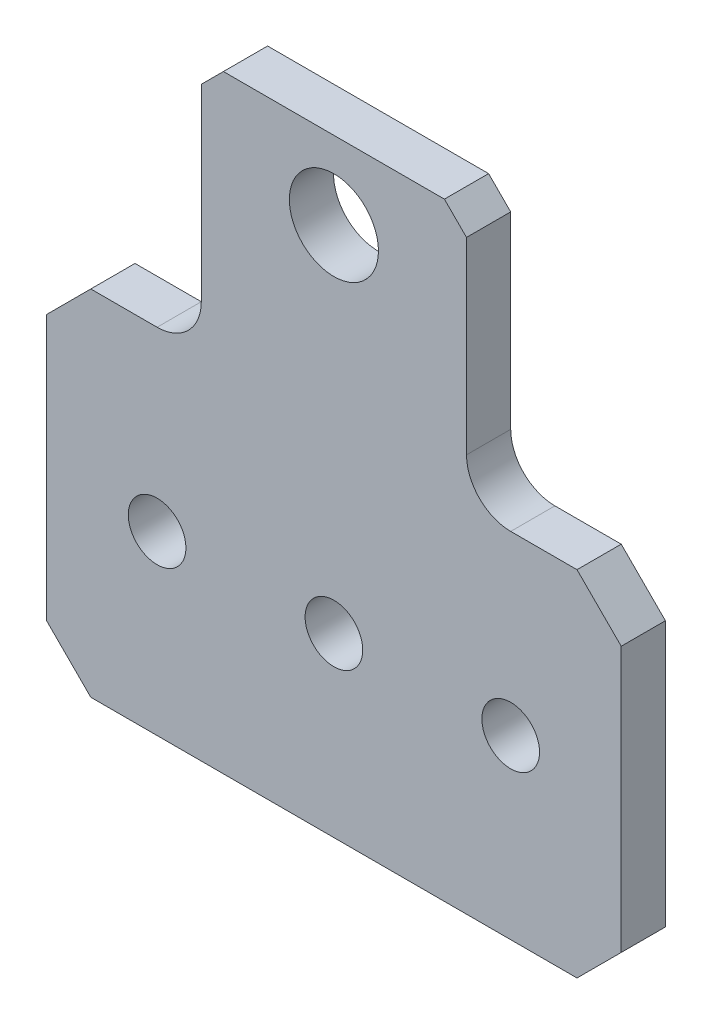
ISO-10303-21;
HEADER;
FILE_DESCRIPTION(('STEP AP214'),'2;1');
FILE_NAME('part.step','',(''),(''),'','','');
FILE_SCHEMA(('AUTOMOTIVE_DESIGN { 1 0 10303 214 1 1 1 1 }'));
ENDSEC;
DATA;
#1=APPLICATION_CONTEXT('core data for automotive mechanical design processes');
#2=APPLICATION_PROTOCOL_DEFINITION('international standard','automotive_design',2000,#1);
#3=PRODUCT_CONTEXT('',#1,'mechanical');
#4=PRODUCT('Part','Part','',(#3));
#5=PRODUCT_RELATED_PRODUCT_CATEGORY('part','',(#4));
#6=PRODUCT_DEFINITION_FORMATION('','',#4);
#7=PRODUCT_DEFINITION_CONTEXT('part definition',#1,'design');
#8=PRODUCT_DEFINITION('design','',#6,#7);
#9=PRODUCT_DEFINITION_SHAPE('','',#8);
#10=(LENGTH_UNIT() NAMED_UNIT(*) SI_UNIT(.MILLI.,.METRE.));
#11=(NAMED_UNIT(*) PLANE_ANGLE_UNIT() SI_UNIT($,.RADIAN.));
#12=(NAMED_UNIT(*) SI_UNIT($,.STERADIAN.) SOLID_ANGLE_UNIT());
#13=UNCERTAINTY_MEASURE_WITH_UNIT(LENGTH_MEASURE(1.E-05),#10,'distance_accuracy_value','');
#14=(GEOMETRIC_REPRESENTATION_CONTEXT(3) GLOBAL_UNCERTAINTY_ASSIGNED_CONTEXT((#13)) GLOBAL_UNIT_ASSIGNED_CONTEXT((#10,
#11,#12)) REPRESENTATION_CONTEXT('',''));
#15=CARTESIAN_POINT('',(0.,0.,0.));
#16=DIRECTION('',(0.,0.,1.));
#17=DIRECTION('',(1.,0.,0.));
#18=AXIS2_PLACEMENT_3D('',#15,#16,#17);
#19=CARTESIAN_POINT('',(-12.7,-12.319,3.175));
#20=DIRECTION('',(0.,0.,1.));
#21=DIRECTION('',(1.,0.,0.));
#22=AXIS2_PLACEMENT_3D('',#19,#20,#21);
#23=PLANE('',#22);
#24=CARTESIAN_POINT('',(0.,-2.79399999999999,3.175));
#25=DIRECTION('',(0.,0.,-1.));
#26=DIRECTION('',(1.,0.,0.));
#27=AXIS2_PLACEMENT_3D('',#24,#25,#26);
#28=CIRCLE('',#27,3.2004);
#29=CARTESIAN_POINT('',(3.20040000000001,-2.79399999999999,3.175));
#30=VERTEX_POINT('',#29);
#31=EDGE_CURVE('E179',#30,#30,#28,.T.);
#32=ORIENTED_EDGE('',*,*,#31,.T.);
#33=EDGE_LOOP('',(#32));
#34=FACE_BOUND('',#33,.T.);
#35=CARTESIAN_POINT('',(-12.7,-28.194,3.175));
#36=DIRECTION('',(0.,0.,-1.));
#37=DIRECTION('',(1.,0.,0.));
#38=AXIS2_PLACEMENT_3D('',#35,#36,#37);
#39=CIRCLE('',#38,2.0701);
#40=CARTESIAN_POINT('',(-10.6299,-28.194,3.175));
#41=VERTEX_POINT('',#40);
#42=EDGE_CURVE('E325',#41,#41,#39,.T.);
#43=ORIENTED_EDGE('',*,*,#42,.T.);
#44=EDGE_LOOP('',(#43));
#45=FACE_BOUND('',#44,.T.);
#46=CARTESIAN_POINT('',(12.7,-28.194,3.175));
#47=DIRECTION('',(0.,0.,-1.));
#48=DIRECTION('',(1.,0.,0.));
#49=AXIS2_PLACEMENT_3D('',#46,#47,#48);
#50=CIRCLE('',#49,2.0701);
#51=CARTESIAN_POINT('',(14.7701,-28.194,3.175));
#52=VERTEX_POINT('',#51);
#53=EDGE_CURVE('E319',#52,#52,#50,.T.);
#54=ORIENTED_EDGE('',*,*,#53,.T.);
#55=EDGE_LOOP('',(#54));
#56=FACE_BOUND('',#55,.T.);
#57=CARTESIAN_POINT('',(0.,-28.194,3.175));
#58=DIRECTION('',(0.,0.,-1.));
#59=DIRECTION('',(1.,0.,0.));
#60=AXIS2_PLACEMENT_3D('',#57,#58,#59);
#61=CIRCLE('',#60,2.0701);
#62=CARTESIAN_POINT('',(2.07010000000001,-28.194,3.175));
#63=VERTEX_POINT('',#62);
#64=EDGE_CURVE('E313',#63,#63,#61,.T.);
#65=ORIENTED_EDGE('',*,*,#64,.T.);
#66=EDGE_LOOP('',(#65));
#67=FACE_BOUND('',#66,.T.);
#68=DIRECTION('',(0.707106781186549,-0.707106781186546,0.));
#69=VECTOR('',#68,1.);
#70=CARTESIAN_POINT('',(7.93749999999999,2.794,3.175));
#71=LINE('',#70,#69);
#72=CARTESIAN_POINT('',(7.93749999999999,2.794,3.175));
#73=VERTEX_POINT('',#72);
#74=CARTESIAN_POINT('',(9.525,1.2065,3.175));
#75=VERTEX_POINT('',#74);
#76=EDGE_CURVE('E162',#73,#75,#71,.T.);
#77=ORIENTED_EDGE('',*,*,#76,.F.);
#78=DIRECTION('',(1.,0.,0.));
#79=VECTOR('',#78,1.);
#80=CARTESIAN_POINT('',(-51.1795207038972,2.794,3.175));
#81=LINE('',#80,#79);
#82=CARTESIAN_POINT('',(-7.9375,2.794,3.175));
#83=VERTEX_POINT('',#82);
#84=EDGE_CURVE('E296',#83,#73,#81,.T.);
#85=ORIENTED_EDGE('',*,*,#84,.F.);
#86=DIRECTION('',(0.707106781186548,0.707106781186547,0.));
#87=VECTOR('',#86,1.);
#88=CARTESIAN_POINT('',(-9.525,1.20650000000001,3.175));
#89=LINE('',#88,#87);
#90=CARTESIAN_POINT('',(-9.525,1.20650000000001,3.175));
#91=VERTEX_POINT('',#90);
#92=EDGE_CURVE('E167',#91,#83,#89,.T.);
#93=ORIENTED_EDGE('',*,*,#92,.F.);
#94=DIRECTION('',(0.,1.,0.));
#95=VECTOR('',#94,1.);
#96=CARTESIAN_POINT('',(-9.52499999999999,-12.319,3.175));
#97=LINE('',#96,#95);
#98=CARTESIAN_POINT('',(-9.52499999999999,-12.319,3.175));
#99=VERTEX_POINT('',#98);
#100=EDGE_CURVE('E170',#99,#91,#97,.T.);
#101=ORIENTED_EDGE('',*,*,#100,.F.);
#102=CARTESIAN_POINT('',(-12.7,-12.319,3.175));
#103=DIRECTION('',(0.,0.,1.));
#104=DIRECTION('',(1.,0.,0.));
#105=AXIS2_PLACEMENT_3D('',#102,#103,#104);
#106=CIRCLE('',#105,3.175);
#107=CARTESIAN_POINT('',(-12.7,-15.494,3.175));
#108=VERTEX_POINT('',#107);
#109=EDGE_CURVE('E358',#108,#99,#106,.T.);
#110=ORIENTED_EDGE('',*,*,#109,.F.);
#111=DIRECTION('',(1.,0.,0.));
#112=VECTOR('',#111,1.);
#113=CARTESIAN_POINT('',(-17.4625,-15.494,3.175));
#114=LINE('',#113,#112);
#115=CARTESIAN_POINT('',(-17.4625,-15.494,3.175));
#116=VERTEX_POINT('',#115);
#117=EDGE_CURVE('E355',#116,#108,#114,.T.);
#118=ORIENTED_EDGE('',*,*,#117,.F.);
#119=DIRECTION('',(0.707106781186546,0.707106781186549,0.));
#120=VECTOR('',#119,1.);
#121=CARTESIAN_POINT('',(-20.6375,-18.669,3.175));
#122=LINE('',#121,#120);
#123=CARTESIAN_POINT('',(-20.6375,-18.669,3.175));
#124=VERTEX_POINT('',#123);
#125=EDGE_CURVE('E352',#124,#116,#122,.T.);
#126=ORIENTED_EDGE('',*,*,#125,.F.);
#127=DIRECTION('',(0.,1.,0.));
#128=VECTOR('',#127,1.);
#129=CARTESIAN_POINT('',(-20.6375,-37.719,3.175));
#130=LINE('',#129,#128);
#131=CARTESIAN_POINT('',(-20.6375,-37.719,3.175));
#132=VERTEX_POINT('',#131);
#133=EDGE_CURVE('E349',#132,#124,#130,.T.);
#134=ORIENTED_EDGE('',*,*,#133,.F.);
#135=DIRECTION('',(-0.707106781186547,0.707106781186547,0.));
#136=VECTOR('',#135,1.);
#137=CARTESIAN_POINT('',(-17.4625,-40.894,3.175));
#138=LINE('',#137,#136);
#139=CARTESIAN_POINT('',(-17.4625,-40.894,3.175));
#140=VERTEX_POINT('',#139);
#141=EDGE_CURVE('E346',#140,#132,#138,.T.);
#142=ORIENTED_EDGE('',*,*,#141,.F.);
#143=DIRECTION('',(-1.,0.,0.));
#144=VECTOR('',#143,1.);
#145=CARTESIAN_POINT('',(17.4625,-40.894,3.175));
#146=LINE('',#145,#144);
#147=CARTESIAN_POINT('',(17.4625,-40.894,3.175));
#148=VERTEX_POINT('',#147);
#149=EDGE_CURVE('E343',#148,#140,#146,.T.);
#150=ORIENTED_EDGE('',*,*,#149,.F.);
#151=DIRECTION('',(-0.707106781186546,-0.707106781186549,0.));
#152=VECTOR('',#151,1.);
#153=CARTESIAN_POINT('',(20.6375,-37.719,3.175));
#154=LINE('',#153,#152);
#155=CARTESIAN_POINT('',(20.6375,-37.719,3.175));
#156=VERTEX_POINT('',#155);
#157=EDGE_CURVE('E340',#156,#148,#154,.T.);
#158=ORIENTED_EDGE('',*,*,#157,.F.);
#159=DIRECTION('',(0.,-1.,0.));
#160=VECTOR('',#159,1.);
#161=CARTESIAN_POINT('',(20.6375,-18.669,3.175));
#162=LINE('',#161,#160);
#163=CARTESIAN_POINT('',(20.6375,-18.669,3.175));
#164=VERTEX_POINT('',#163);
#165=EDGE_CURVE('E337',#164,#156,#162,.T.);
#166=ORIENTED_EDGE('',*,*,#165,.F.);
#167=DIRECTION('',(0.707106781186547,-0.707106781186548,0.));
#168=VECTOR('',#167,1.);
#169=CARTESIAN_POINT('',(17.4625,-15.494,3.175));
#170=LINE('',#169,#168);
#171=CARTESIAN_POINT('',(17.4625,-15.494,3.175));
#172=VERTEX_POINT('',#171);
#173=EDGE_CURVE('E335',#172,#164,#170,.T.);
#174=ORIENTED_EDGE('',*,*,#173,.F.);
#175=DIRECTION('',(1.,0.,0.));
#176=VECTOR('',#175,1.);
#177=CARTESIAN_POINT('',(12.7,-15.494,3.175));
#178=LINE('',#177,#176);
#179=CARTESIAN_POINT('',(12.7,-15.494,3.175));
#180=VERTEX_POINT('',#179);
#181=EDGE_CURVE('E217',#180,#172,#178,.T.);
#182=ORIENTED_EDGE('',*,*,#181,.F.);
#183=CARTESIAN_POINT('',(12.7,-12.319,3.175));
#184=DIRECTION('',(0.,0.,1.));
#185=DIRECTION('',(1.,0.,0.));
#186=AXIS2_PLACEMENT_3D('',#183,#184,#185);
#187=CIRCLE('',#186,3.175);
#188=CARTESIAN_POINT('',(9.525,-12.319,3.175));
#189=VERTEX_POINT('',#188);
#190=EDGE_CURVE('E163',#189,#180,#187,.T.);
#191=ORIENTED_EDGE('',*,*,#190,.F.);
#192=DIRECTION('',(0.,-1.,0.));
#193=VECTOR('',#192,1.);
#194=CARTESIAN_POINT('',(9.525,1.2065,3.175));
#195=LINE('',#194,#193);
#196=EDGE_CURVE('E150',#75,#189,#195,.T.);
#197=ORIENTED_EDGE('',*,*,#196,.F.);
#198=EDGE_LOOP('',(#77,#85,#93,#101,#110,#118,#126,#134,#142,#150,#158,#166,#174,#182,#191,#197));
#199=FACE_BOUND('',#198,.T.);
#200=ADVANCED_FACE('F35',(#34,#45,#56,#67,#199),#23,.T.);
#201=CARTESIAN_POINT('',(-12.7,-12.319,0.));
#202=DIRECTION('',(0.,0.,1.));
#203=DIRECTION('',(1.,0.,0.));
#204=AXIS2_PLACEMENT_3D('',#201,#202,#203);
#205=PLANE('',#204);
#206=CARTESIAN_POINT('',(0.,-2.79399999999999,0.));
#207=DIRECTION('',(0.,0.,-1.));
#208=DIRECTION('',(1.,0.,0.));
#209=AXIS2_PLACEMENT_3D('',#206,#207,#208);
#210=CIRCLE('',#209,3.2004);
#211=CARTESIAN_POINT('',(3.20040000000001,-2.79399999999999,0.));
#212=VERTEX_POINT('',#211);
#213=EDGE_CURVE('E328',#212,#212,#210,.T.);
#214=ORIENTED_EDGE('',*,*,#213,.F.);
#215=EDGE_LOOP('',(#214));
#216=FACE_BOUND('',#215,.T.);
#217=CARTESIAN_POINT('',(-12.7,-28.194,0.));
#218=DIRECTION('',(0.,0.,-1.));
#219=DIRECTION('',(1.,0.,0.));
#220=AXIS2_PLACEMENT_3D('',#217,#218,#219);
#221=CIRCLE('',#220,2.0701);
#222=CARTESIAN_POINT('',(-10.6299,-28.194,0.));
#223=VERTEX_POINT('',#222);
#224=EDGE_CURVE('E322',#223,#223,#221,.T.);
#225=ORIENTED_EDGE('',*,*,#224,.F.);
#226=EDGE_LOOP('',(#225));
#227=FACE_BOUND('',#226,.T.);
#228=CARTESIAN_POINT('',(12.7,-28.194,0.));
#229=DIRECTION('',(0.,0.,-1.));
#230=DIRECTION('',(1.,0.,0.));
#231=AXIS2_PLACEMENT_3D('',#228,#229,#230);
#232=CIRCLE('',#231,2.0701);
#233=CARTESIAN_POINT('',(14.7701,-28.194,0.));
#234=VERTEX_POINT('',#233);
#235=EDGE_CURVE('E317',#234,#234,#232,.T.);
#236=ORIENTED_EDGE('',*,*,#235,.F.);
#237=EDGE_LOOP('',(#236));
#238=FACE_BOUND('',#237,.T.);
#239=CARTESIAN_POINT('',(0.,-28.194,0.));
#240=DIRECTION('',(0.,0.,-1.));
#241=DIRECTION('',(1.,0.,0.));
#242=AXIS2_PLACEMENT_3D('',#239,#240,#241);
#243=CIRCLE('',#242,2.0701);
#244=CARTESIAN_POINT('',(2.07010000000001,-28.194,0.));
#245=VERTEX_POINT('',#244);
#246=EDGE_CURVE('E310',#245,#245,#243,.T.);
#247=ORIENTED_EDGE('',*,*,#246,.F.);
#248=EDGE_LOOP('',(#247));
#249=FACE_BOUND('',#248,.T.);
#250=DIRECTION('',(1.,0.,0.));
#251=VECTOR('',#250,1.);
#252=CARTESIAN_POINT('',(-51.1795207038972,2.794,0.));
#253=LINE('',#252,#251);
#254=CARTESIAN_POINT('',(-7.93749999999999,2.794,0.));
#255=VERTEX_POINT('',#254);
#256=CARTESIAN_POINT('',(7.93749999999999,2.794,0.));
#257=VERTEX_POINT('',#256);
#258=EDGE_CURVE('E292',#255,#257,#253,.T.);
#259=ORIENTED_EDGE('',*,*,#258,.T.);
#260=DIRECTION('',(0.707106781186549,-0.707106781186546,0.));
#261=VECTOR('',#260,1.);
#262=CARTESIAN_POINT('',(7.93749999999999,2.794,0.));
#263=LINE('',#262,#261);
#264=CARTESIAN_POINT('',(9.525,1.2065,0.));
#265=VERTEX_POINT('',#264);
#266=EDGE_CURVE('E212',#257,#265,#263,.T.);
#267=ORIENTED_EDGE('',*,*,#266,.T.);
#268=DIRECTION('',(0.,-1.,0.));
#269=VECTOR('',#268,1.);
#270=CARTESIAN_POINT('',(9.525,1.2065,0.));
#271=LINE('',#270,#269);
#272=CARTESIAN_POINT('',(9.525,-12.319,0.));
#273=VERTEX_POINT('',#272);
#274=EDGE_CURVE('E152',#265,#273,#271,.T.);
#275=ORIENTED_EDGE('',*,*,#274,.T.);
#276=CARTESIAN_POINT('',(12.7,-12.319,0.));
#277=DIRECTION('',(0.,0.,1.));
#278=DIRECTION('',(1.,0.,0.));
#279=AXIS2_PLACEMENT_3D('',#276,#277,#278);
#280=CIRCLE('',#279,3.175);
#281=CARTESIAN_POINT('',(12.7,-15.494,0.));
#282=VERTEX_POINT('',#281);
#283=EDGE_CURVE('E215',#273,#282,#280,.T.);
#284=ORIENTED_EDGE('',*,*,#283,.T.);
#285=DIRECTION('',(1.,0.,0.));
#286=VECTOR('',#285,1.);
#287=CARTESIAN_POINT('',(12.7,-15.494,0.));
#288=LINE('',#287,#286);
#289=CARTESIAN_POINT('',(17.4625,-15.494,0.));
#290=VERTEX_POINT('',#289);
#291=EDGE_CURVE('E175',#282,#290,#288,.T.);
#292=ORIENTED_EDGE('',*,*,#291,.T.);
#293=DIRECTION('',(0.707106781186547,-0.707106781186548,0.));
#294=VECTOR('',#293,1.);
#295=CARTESIAN_POINT('',(17.4625,-15.494,0.));
#296=LINE('',#295,#294);
#297=CARTESIAN_POINT('',(20.6375,-18.669,0.));
#298=VERTEX_POINT('',#297);
#299=EDGE_CURVE('E178',#290,#298,#296,.T.);
#300=ORIENTED_EDGE('',*,*,#299,.T.);
#301=DIRECTION('',(0.,-1.,0.));
#302=VECTOR('',#301,1.);
#303=CARTESIAN_POINT('',(20.6375,-18.669,0.));
#304=LINE('',#303,#302);
#305=CARTESIAN_POINT('',(20.6375,-37.719,0.));
#306=VERTEX_POINT('',#305);
#307=EDGE_CURVE('E182',#298,#306,#304,.T.);
#308=ORIENTED_EDGE('',*,*,#307,.T.);
#309=DIRECTION('',(-0.707106781186546,-0.707106781186549,0.));
#310=VECTOR('',#309,1.);
#311=CARTESIAN_POINT('',(20.6375,-37.719,0.));
#312=LINE('',#311,#310);
#313=CARTESIAN_POINT('',(17.4625,-40.894,0.));
#314=VERTEX_POINT('',#313);
#315=EDGE_CURVE('E185',#306,#314,#312,.T.);
#316=ORIENTED_EDGE('',*,*,#315,.T.);
#317=DIRECTION('',(-1.,0.,0.));
#318=VECTOR('',#317,1.);
#319=CARTESIAN_POINT('',(17.4625,-40.894,0.));
#320=LINE('',#319,#318);
#321=CARTESIAN_POINT('',(-17.4625,-40.894,0.));
#322=VERTEX_POINT('',#321);
#323=EDGE_CURVE('E188',#314,#322,#320,.T.);
#324=ORIENTED_EDGE('',*,*,#323,.T.);
#325=DIRECTION('',(-0.707106781186547,0.707106781186547,0.));
#326=VECTOR('',#325,1.);
#327=CARTESIAN_POINT('',(-17.4625,-40.894,0.));
#328=LINE('',#327,#326);
#329=CARTESIAN_POINT('',(-20.6375,-37.719,0.));
#330=VERTEX_POINT('',#329);
#331=EDGE_CURVE('E191',#322,#330,#328,.T.);
#332=ORIENTED_EDGE('',*,*,#331,.T.);
#333=DIRECTION('',(0.,1.,0.));
#334=VECTOR('',#333,1.);
#335=CARTESIAN_POINT('',(-20.6375,-37.719,0.));
#336=LINE('',#335,#334);
#337=CARTESIAN_POINT('',(-20.6375,-18.669,0.));
#338=VERTEX_POINT('',#337);
#339=EDGE_CURVE('E194',#330,#338,#336,.T.);
#340=ORIENTED_EDGE('',*,*,#339,.T.);
#341=DIRECTION('',(0.707106781186546,0.707106781186549,0.));
#342=VECTOR('',#341,1.);
#343=CARTESIAN_POINT('',(-20.6375,-18.669,0.));
#344=LINE('',#343,#342);
#345=CARTESIAN_POINT('',(-17.4625,-15.494,0.));
#346=VERTEX_POINT('',#345);
#347=EDGE_CURVE('E197',#338,#346,#344,.T.);
#348=ORIENTED_EDGE('',*,*,#347,.T.);
#349=DIRECTION('',(1.,0.,0.));
#350=VECTOR('',#349,1.);
#351=CARTESIAN_POINT('',(-17.4625,-15.494,0.));
#352=LINE('',#351,#350);
#353=CARTESIAN_POINT('',(-12.7,-15.494,0.));
#354=VERTEX_POINT('',#353);
#355=EDGE_CURVE('E200',#346,#354,#352,.T.);
#356=ORIENTED_EDGE('',*,*,#355,.T.);
#357=CARTESIAN_POINT('',(-12.7,-12.319,0.));
#358=DIRECTION('',(0.,0.,1.));
#359=DIRECTION('',(1.,0.,0.));
#360=AXIS2_PLACEMENT_3D('',#357,#358,#359);
#361=CIRCLE('',#360,3.175);
#362=CARTESIAN_POINT('',(-9.52499999999999,-12.319,0.));
#363=VERTEX_POINT('',#362);
#364=EDGE_CURVE('E203',#354,#363,#361,.T.);
#365=ORIENTED_EDGE('',*,*,#364,.T.);
#366=DIRECTION('',(0.,1.,0.));
#367=VECTOR('',#366,1.);
#368=CARTESIAN_POINT('',(-9.52499999999999,-12.319,0.));
#369=LINE('',#368,#367);
#370=CARTESIAN_POINT('',(-9.525,1.20650000000001,0.));
#371=VERTEX_POINT('',#370);
#372=EDGE_CURVE('E206',#363,#371,#369,.T.);
#373=ORIENTED_EDGE('',*,*,#372,.T.);
#374=DIRECTION('',(0.707106781186548,0.707106781186547,0.));
#375=VECTOR('',#374,1.);
#376=CARTESIAN_POINT('',(-9.525,1.20650000000001,0.));
#377=LINE('',#376,#375);
#378=EDGE_CURVE('E209',#371,#255,#377,.T.);
#379=ORIENTED_EDGE('',*,*,#378,.T.);
#380=EDGE_LOOP('',(#259,#267,#275,#284,#292,#300,#308,#316,#324,#332,#340,#348,#356,#365,#373,#379));
#381=FACE_BOUND('',#380,.T.);
#382=ADVANCED_FACE('F246',(#216,#227,#238,#249,#381),#205,.F.);
#383=CARTESIAN_POINT('',(12.7,-15.494,3.175));
#384=DIRECTION('',(0.,1.,0.));
#385=DIRECTION('',(-1.,0.,0.));
#386=AXIS2_PLACEMENT_3D('',#383,#384,#385);
#387=PLANE('',#386);
#388=ORIENTED_EDGE('',*,*,#291,.F.);
#389=DIRECTION('',(0.,0.,-1.));
#390=VECTOR('',#389,1.);
#391=CARTESIAN_POINT('',(12.7,-15.494,3.175));
#392=LINE('',#391,#390);
#393=EDGE_CURVE('E11',#180,#282,#392,.T.);
#394=ORIENTED_EDGE('',*,*,#393,.F.);
#395=ORIENTED_EDGE('',*,*,#181,.T.);
#396=DIRECTION('',(0.,0.,-1.));
#397=VECTOR('',#396,1.);
#398=CARTESIAN_POINT('',(17.4625,-15.494,3.175));
#399=LINE('',#398,#397);
#400=EDGE_CURVE('E39',#172,#290,#399,.T.);
#401=ORIENTED_EDGE('',*,*,#400,.T.);
#402=EDGE_LOOP('',(#388,#394,#395,#401));
#403=FACE_BOUND('',#402,.T.);
#404=ADVANCED_FACE('F37',(#403),#387,.T.);
#405=CARTESIAN_POINT('',(12.7,-12.319,3.175));
#406=DIRECTION('',(0.,0.,-1.));
#407=DIRECTION('',(-1.,0.,0.));
#408=AXIS2_PLACEMENT_3D('',#405,#406,#407);
#409=CYLINDRICAL_SURFACE('',#408,3.175);
#410=ORIENTED_EDGE('',*,*,#283,.F.);
#411=DIRECTION('',(0.,0.,-1.));
#412=VECTOR('',#411,1.);
#413=CARTESIAN_POINT('',(9.525,-12.319,3.175));
#414=LINE('',#413,#412);
#415=EDGE_CURVE('E45',#189,#273,#414,.T.);
#416=ORIENTED_EDGE('',*,*,#415,.F.);
#417=ORIENTED_EDGE('',*,*,#190,.T.);
#418=ORIENTED_EDGE('',*,*,#393,.T.);
#419=EDGE_LOOP('',(#410,#416,#417,#418));
#420=FACE_BOUND('',#419,.T.);
#421=ADVANCED_FACE('F247',(#420),#409,.F.);
#422=CARTESIAN_POINT('',(9.525,1.2065,3.175));
#423=DIRECTION('',(1.,0.,0.));
#424=DIRECTION('',(0.,0.,-1.));
#425=AXIS2_PLACEMENT_3D('',#422,#423,#424);
#426=PLANE('',#425);
#427=ORIENTED_EDGE('',*,*,#274,.F.);
#428=DIRECTION('',(0.,0.,-1.));
#429=VECTOR('',#428,1.);
#430=CARTESIAN_POINT('',(9.525,1.2065,3.175));
#431=LINE('',#430,#429);
#432=EDGE_CURVE('E147',#75,#265,#431,.T.);
#433=ORIENTED_EDGE('',*,*,#432,.F.);
#434=ORIENTED_EDGE('',*,*,#196,.T.);
#435=ORIENTED_EDGE('',*,*,#415,.T.);
#436=EDGE_LOOP('',(#427,#433,#434,#435));
#437=FACE_BOUND('',#436,.T.);
#438=ADVANCED_FACE('F149',(#437),#426,.T.);
#439=CARTESIAN_POINT('',(7.93749999999999,2.794,3.175));
#440=DIRECTION('',(0.707106781186546,0.707106781186549,0.));
#441=DIRECTION('',(-0.707106781186549,0.707106781186546,0.));
#442=AXIS2_PLACEMENT_3D('',#439,#440,#441);
#443=PLANE('',#442);
#444=ORIENTED_EDGE('',*,*,#266,.F.);
#445=DIRECTION('',(0.,0.,-1.));
#446=VECTOR('',#445,1.);
#447=CARTESIAN_POINT('',(7.93749999999999,2.794,3.175));
#448=LINE('',#447,#446);
#449=EDGE_CURVE('E157',#73,#257,#448,.T.);
#450=ORIENTED_EDGE('',*,*,#449,.F.);
#451=ORIENTED_EDGE('',*,*,#76,.T.);
#452=ORIENTED_EDGE('',*,*,#432,.T.);
#453=EDGE_LOOP('',(#444,#450,#451,#452));
#454=FACE_BOUND('',#453,.T.);
#455=ADVANCED_FACE('F166',(#454),#443,.T.);
#456=CARTESIAN_POINT('',(-9.525,1.20650000000001,3.175));
#457=DIRECTION('',(-0.707106781186547,0.707106781186548,0.));
#458=DIRECTION('',(-0.707106781186548,-0.707106781186547,0.));
#459=AXIS2_PLACEMENT_3D('',#456,#457,#458);
#460=PLANE('',#459);
#461=ORIENTED_EDGE('',*,*,#378,.F.);
#462=DIRECTION('',(0.,0.,-1.));
#463=VECTOR('',#462,1.);
#464=CARTESIAN_POINT('',(-9.525,1.20650000000001,3.175));
#465=LINE('',#464,#463);
#466=EDGE_CURVE('E224',#91,#371,#465,.T.);
#467=ORIENTED_EDGE('',*,*,#466,.F.);
#468=ORIENTED_EDGE('',*,*,#92,.T.);
#469=DIRECTION('',(0.,0.,-1.));
#470=VECTOR('',#469,1.);
#471=CARTESIAN_POINT('',(-7.93749999999999,2.794,3.175));
#472=LINE('',#471,#470);
#473=EDGE_CURVE('E221',#83,#255,#472,.T.);
#474=ORIENTED_EDGE('',*,*,#473,.T.);
#475=EDGE_LOOP('',(#461,#467,#468,#474));
#476=FACE_BOUND('',#475,.T.);
#477=ADVANCED_FACE('F300',(#476),#460,.T.);
#478=CARTESIAN_POINT('',(-9.52499999999999,-12.319,3.175));
#479=DIRECTION('',(-1.,0.,0.));
#480=DIRECTION('',(0.,-1.,0.));
#481=AXIS2_PLACEMENT_3D('',#478,#479,#480);
#482=PLANE('',#481);
#483=ORIENTED_EDGE('',*,*,#372,.F.);
#484=DIRECTION('',(0.,0.,-1.));
#485=VECTOR('',#484,1.);
#486=CARTESIAN_POINT('',(-9.52499999999999,-12.319,3.175));
#487=LINE('',#486,#485);
#488=EDGE_CURVE('E226',#99,#363,#487,.T.);
#489=ORIENTED_EDGE('',*,*,#488,.F.);
#490=ORIENTED_EDGE('',*,*,#100,.T.);
#491=ORIENTED_EDGE('',*,*,#466,.T.);
#492=EDGE_LOOP('',(#483,#489,#490,#491));
#493=FACE_BOUND('',#492,.T.);
#494=ADVANCED_FACE('F305',(#493),#482,.T.);
#495=CARTESIAN_POINT('',(-12.7,-12.319,3.175));
#496=DIRECTION('',(0.,0.,-1.));
#497=DIRECTION('',(-1.,0.,0.));
#498=AXIS2_PLACEMENT_3D('',#495,#496,#497);
#499=CYLINDRICAL_SURFACE('',#498,3.175);
#500=ORIENTED_EDGE('',*,*,#364,.F.);
#501=DIRECTION('',(0.,0.,-1.));
#502=VECTOR('',#501,1.);
#503=CARTESIAN_POINT('',(-12.7,-15.494,3.175));
#504=LINE('',#503,#502);
#505=EDGE_CURVE('E228',#108,#354,#504,.T.);
#506=ORIENTED_EDGE('',*,*,#505,.F.);
#507=ORIENTED_EDGE('',*,*,#109,.T.);
#508=ORIENTED_EDGE('',*,*,#488,.T.);
#509=EDGE_LOOP('',(#500,#506,#507,#508));
#510=FACE_BOUND('',#509,.T.);
#511=ADVANCED_FACE('F360',(#510),#499,.F.);
#512=CARTESIAN_POINT('',(-17.4625,-15.494,3.175));
#513=DIRECTION('',(0.,1.,0.));
#514=DIRECTION('',(0.,0.,1.));
#515=AXIS2_PLACEMENT_3D('',#512,#513,#514);
#516=PLANE('',#515);
#517=ORIENTED_EDGE('',*,*,#355,.F.);
#518=DIRECTION('',(0.,0.,-1.));
#519=VECTOR('',#518,1.);
#520=CARTESIAN_POINT('',(-17.4625,-15.494,3.175));
#521=LINE('',#520,#519);
#522=EDGE_CURVE('E230',#116,#346,#521,.T.);
#523=ORIENTED_EDGE('',*,*,#522,.F.);
#524=ORIENTED_EDGE('',*,*,#117,.T.);
#525=ORIENTED_EDGE('',*,*,#505,.T.);
#526=EDGE_LOOP('',(#517,#523,#524,#525));
#527=FACE_BOUND('',#526,.T.);
#528=ADVANCED_FACE('F365',(#527),#516,.T.);
#529=CARTESIAN_POINT('',(-20.6375,-18.669,3.175));
#530=DIRECTION('',(-0.707106781186549,0.707106781186546,0.));
#531=DIRECTION('',(-0.707106781186546,-0.707106781186549,0.));
#532=AXIS2_PLACEMENT_3D('',#529,#530,#531);
#533=PLANE('',#532);
#534=ORIENTED_EDGE('',*,*,#347,.F.);
#535=DIRECTION('',(0.,0.,-1.));
#536=VECTOR('',#535,1.);
#537=CARTESIAN_POINT('',(-20.6375,-18.669,3.175));
#538=LINE('',#537,#536);
#539=EDGE_CURVE('E232',#124,#338,#538,.T.);
#540=ORIENTED_EDGE('',*,*,#539,.F.);
#541=ORIENTED_EDGE('',*,*,#125,.T.);
#542=ORIENTED_EDGE('',*,*,#522,.T.);
#543=EDGE_LOOP('',(#534,#540,#541,#542));
#544=FACE_BOUND('',#543,.T.);
#545=ADVANCED_FACE('F368',(#544),#533,.T.);
#546=CARTESIAN_POINT('',(-20.6375,-37.719,3.175));
#547=DIRECTION('',(-1.,0.,0.));
#548=DIRECTION('',(0.,-1.,0.));
#549=AXIS2_PLACEMENT_3D('',#546,#547,#548);
#550=PLANE('',#549);
#551=ORIENTED_EDGE('',*,*,#339,.F.);
#552=DIRECTION('',(0.,0.,-1.));
#553=VECTOR('',#552,1.);
#554=CARTESIAN_POINT('',(-20.6375,-37.719,3.175));
#555=LINE('',#554,#553);
#556=EDGE_CURVE('E234',#132,#330,#555,.T.);
#557=ORIENTED_EDGE('',*,*,#556,.F.);
#558=ORIENTED_EDGE('',*,*,#133,.T.);
#559=ORIENTED_EDGE('',*,*,#539,.T.);
#560=EDGE_LOOP('',(#551,#557,#558,#559));
#561=FACE_BOUND('',#560,.T.);
#562=ADVANCED_FACE('F373',(#561),#550,.T.);
#563=CARTESIAN_POINT('',(-17.4625,-40.894,3.175));
#564=DIRECTION('',(-0.707106781186548,-0.707106781186548,0.));
#565=DIRECTION('',(0.707106781186548,-0.707106781186548,0.));
#566=AXIS2_PLACEMENT_3D('',#563,#564,#565);
#567=PLANE('',#566);
#568=ORIENTED_EDGE('',*,*,#331,.F.);
#569=DIRECTION('',(0.,0.,-1.));
#570=VECTOR('',#569,1.);
#571=CARTESIAN_POINT('',(-17.4625,-40.894,3.175));
#572=LINE('',#571,#570);
#573=EDGE_CURVE('E236',#140,#322,#572,.T.);
#574=ORIENTED_EDGE('',*,*,#573,.F.);
#575=ORIENTED_EDGE('',*,*,#141,.T.);
#576=ORIENTED_EDGE('',*,*,#556,.T.);
#577=EDGE_LOOP('',(#568,#574,#575,#576));
#578=FACE_BOUND('',#577,.T.);
#579=ADVANCED_FACE('F376',(#578),#567,.T.);
#580=CARTESIAN_POINT('',(17.4625,-40.894,3.175));
#581=DIRECTION('',(0.,-1.,0.));
#582=DIRECTION('',(1.,0.,0.));
#583=AXIS2_PLACEMENT_3D('',#580,#581,#582);
#584=PLANE('',#583);
#585=ORIENTED_EDGE('',*,*,#323,.F.);
#586=DIRECTION('',(0.,0.,-1.));
#587=VECTOR('',#586,1.);
#588=CARTESIAN_POINT('',(17.4625,-40.894,3.175));
#589=LINE('',#588,#587);
#590=EDGE_CURVE('E238',#148,#314,#589,.T.);
#591=ORIENTED_EDGE('',*,*,#590,.F.);
#592=ORIENTED_EDGE('',*,*,#149,.T.);
#593=ORIENTED_EDGE('',*,*,#573,.T.);
#594=EDGE_LOOP('',(#585,#591,#592,#593));
#595=FACE_BOUND('',#594,.T.);
#596=ADVANCED_FACE('F381',(#595),#584,.T.);
#597=CARTESIAN_POINT('',(20.6375,-37.719,3.175));
#598=DIRECTION('',(0.707106781186549,-0.707106781186546,0.));
#599=DIRECTION('',(0.707106781186546,0.707106781186549,0.));
#600=AXIS2_PLACEMENT_3D('',#597,#598,#599);
#601=PLANE('',#600);
#602=ORIENTED_EDGE('',*,*,#315,.F.);
#603=DIRECTION('',(0.,0.,-1.));
#604=VECTOR('',#603,1.);
#605=CARTESIAN_POINT('',(20.6375,-37.719,3.175));
#606=LINE('',#605,#604);
#607=EDGE_CURVE('E240',#156,#306,#606,.T.);
#608=ORIENTED_EDGE('',*,*,#607,.F.);
#609=ORIENTED_EDGE('',*,*,#157,.T.);
#610=ORIENTED_EDGE('',*,*,#590,.T.);
#611=EDGE_LOOP('',(#602,#608,#609,#610));
#612=FACE_BOUND('',#611,.T.);
#613=ADVANCED_FACE('F384',(#612),#601,.T.);
#614=CARTESIAN_POINT('',(20.6375,-18.669,3.175));
#615=DIRECTION('',(1.,0.,0.));
#616=DIRECTION('',(0.,0.,-1.));
#617=AXIS2_PLACEMENT_3D('',#614,#615,#616);
#618=PLANE('',#617);
#619=ORIENTED_EDGE('',*,*,#307,.F.);
#620=DIRECTION('',(0.,0.,-1.));
#621=VECTOR('',#620,1.);
#622=CARTESIAN_POINT('',(20.6375,-18.669,3.175));
#623=LINE('',#622,#621);
#624=EDGE_CURVE('E241',#164,#298,#623,.T.);
#625=ORIENTED_EDGE('',*,*,#624,.F.);
#626=ORIENTED_EDGE('',*,*,#165,.T.);
#627=ORIENTED_EDGE('',*,*,#607,.T.);
#628=EDGE_LOOP('',(#619,#625,#626,#627));
#629=FACE_BOUND('',#628,.T.);
#630=ADVANCED_FACE('F387',(#629),#618,.T.);
#631=CARTESIAN_POINT('',(17.4625,-15.494,3.175));
#632=DIRECTION('',(0.707106781186548,0.707106781186547,0.));
#633=DIRECTION('',(-0.707106781186547,0.707106781186548,0.));
#634=AXIS2_PLACEMENT_3D('',#631,#632,#633);
#635=PLANE('',#634);
#636=ORIENTED_EDGE('',*,*,#299,.F.);
#637=ORIENTED_EDGE('',*,*,#400,.F.);
#638=ORIENTED_EDGE('',*,*,#173,.T.);
#639=ORIENTED_EDGE('',*,*,#624,.T.);
#640=EDGE_LOOP('',(#636,#637,#638,#639));
#641=FACE_BOUND('',#640,.T.);
#642=ADVANCED_FACE('F243',(#641),#635,.T.);
#643=CARTESIAN_POINT('',(0.,-2.79399999999999,3.175));
#644=DIRECTION('',(0.,0.,-1.));
#645=DIRECTION('',(-1.,0.,0.));
#646=AXIS2_PLACEMENT_3D('',#643,#644,#645);
#647=CYLINDRICAL_SURFACE('',#646,3.2004);
#648=ORIENTED_EDGE('',*,*,#31,.F.);
#649=EDGE_LOOP('',(#648));
#650=FACE_BOUND('',#649,.T.);
#651=ORIENTED_EDGE('',*,*,#213,.T.);
#652=EDGE_LOOP('',(#651));
#653=FACE_BOUND('',#652,.T.);
#654=ADVANCED_FACE('F267',(#650,#653),#647,.F.);
#655=CARTESIAN_POINT('',(-12.7,-28.194,3.175));
#656=DIRECTION('',(0.,0.,-1.));
#657=DIRECTION('',(-1.,0.,0.));
#658=AXIS2_PLACEMENT_3D('',#655,#656,#657);
#659=CYLINDRICAL_SURFACE('',#658,2.0701);
#660=ORIENTED_EDGE('',*,*,#42,.F.);
#661=EDGE_LOOP('',(#660));
#662=FACE_BOUND('',#661,.T.);
#663=ORIENTED_EDGE('',*,*,#224,.T.);
#664=EDGE_LOOP('',(#663));
#665=FACE_BOUND('',#664,.T.);
#666=ADVANCED_FACE('F270',(#662,#665),#659,.F.);
#667=CARTESIAN_POINT('',(12.7,-28.194,3.175));
#668=DIRECTION('',(0.,0.,-1.));
#669=DIRECTION('',(-1.,0.,0.));
#670=AXIS2_PLACEMENT_3D('',#667,#668,#669);
#671=CYLINDRICAL_SURFACE('',#670,2.0701);
#672=ORIENTED_EDGE('',*,*,#53,.F.);
#673=EDGE_LOOP('',(#672));
#674=FACE_BOUND('',#673,.T.);
#675=ORIENTED_EDGE('',*,*,#235,.T.);
#676=EDGE_LOOP('',(#675));
#677=FACE_BOUND('',#676,.T.);
#678=ADVANCED_FACE('F274',(#674,#677),#671,.F.);
#679=CARTESIAN_POINT('',(0.,-28.194,3.175));
#680=DIRECTION('',(0.,0.,-1.));
#681=DIRECTION('',(-1.,0.,0.));
#682=AXIS2_PLACEMENT_3D('',#679,#680,#681);
#683=CYLINDRICAL_SURFACE('',#682,2.0701);
#684=ORIENTED_EDGE('',*,*,#64,.F.);
#685=EDGE_LOOP('',(#684));
#686=FACE_BOUND('',#685,.T.);
#687=ORIENTED_EDGE('',*,*,#246,.T.);
#688=EDGE_LOOP('',(#687));
#689=FACE_BOUND('',#688,.T.);
#690=ADVANCED_FACE('F278',(#686,#689),#683,.F.);
#691=CARTESIAN_POINT('',(-51.1795207038972,2.794,3.175));
#692=DIRECTION('',(0.,1.,0.));
#693=DIRECTION('',(0.,0.,1.));
#694=AXIS2_PLACEMENT_3D('',#691,#692,#693);
#695=PLANE('',#694);
#696=ORIENTED_EDGE('',*,*,#258,.F.);
#697=ORIENTED_EDGE('',*,*,#473,.F.);
#698=ORIENTED_EDGE('',*,*,#84,.T.);
#699=ORIENTED_EDGE('',*,*,#449,.T.);
#700=EDGE_LOOP('',(#696,#697,#698,#699));
#701=FACE_BOUND('',#700,.T.);
#702=ADVANCED_FACE('F282',(#701),#695,.T.);
#703=CLOSED_SHELL('',(#200,#382,#404,#421,#438,#455,#477,#494,#511,#528,#545,#562,#579,#596,
#613,#630,#642,#654,#666,#678,#690,#702));
#704=MANIFOLD_SOLID_BREP('B2',#703);
#705=ADVANCED_BREP_SHAPE_REPRESENTATION('',(#18,#704),#14);
#706=SHAPE_DEFINITION_REPRESENTATION(#9,#705);
ENDSEC;
END-ISO-10303-21;
